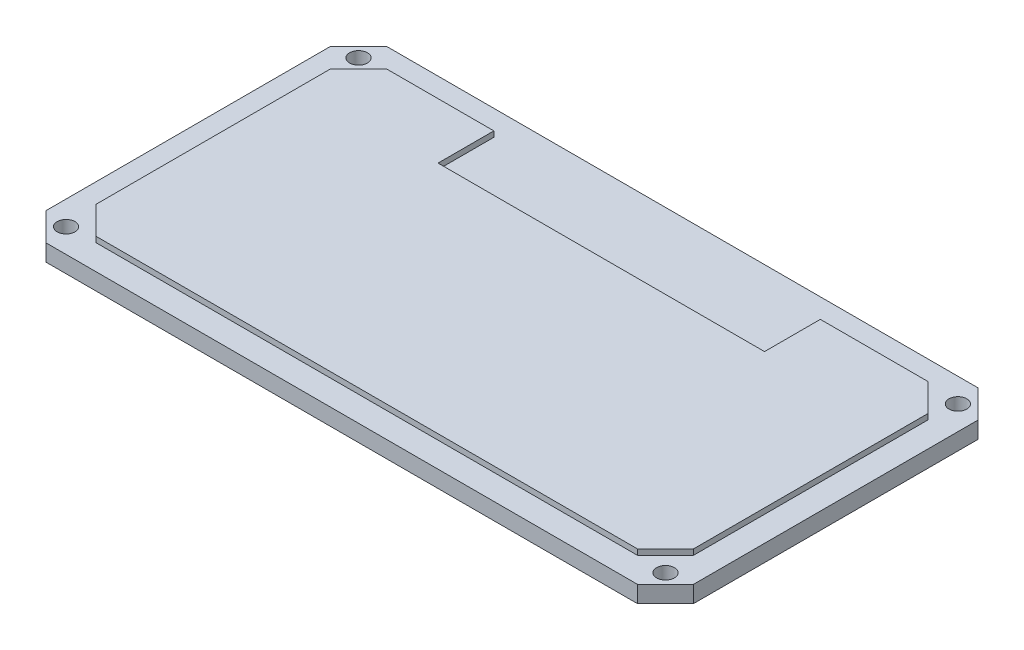
ISO-10303-21;
HEADER;
FILE_DESCRIPTION(('STEP AP214'),'2;1');
FILE_NAME('part.step','',(''),(''),'','','');
FILE_SCHEMA(('AUTOMOTIVE_DESIGN { 1 0 10303 214 1 1 1 1 }'));
ENDSEC;
DATA;
#1=APPLICATION_CONTEXT('core data for automotive mechanical design processes');
#2=APPLICATION_PROTOCOL_DEFINITION('international standard','automotive_design',2000,#1);
#3=PRODUCT_CONTEXT('',#1,'mechanical');
#4=PRODUCT('Part','Part','',(#3));
#5=PRODUCT_RELATED_PRODUCT_CATEGORY('part','',(#4));
#6=PRODUCT_DEFINITION_FORMATION('','',#4);
#7=PRODUCT_DEFINITION_CONTEXT('part definition',#1,'design');
#8=PRODUCT_DEFINITION('design','',#6,#7);
#9=PRODUCT_DEFINITION_SHAPE('','',#8);
#10=(LENGTH_UNIT() NAMED_UNIT(*) SI_UNIT(.MILLI.,.METRE.));
#11=(NAMED_UNIT(*) PLANE_ANGLE_UNIT() SI_UNIT($,.RADIAN.));
#12=(NAMED_UNIT(*) SI_UNIT($,.STERADIAN.) SOLID_ANGLE_UNIT());
#13=UNCERTAINTY_MEASURE_WITH_UNIT(LENGTH_MEASURE(1.E-05),#10,'distance_accuracy_value','');
#14=(GEOMETRIC_REPRESENTATION_CONTEXT(3) GLOBAL_UNCERTAINTY_ASSIGNED_CONTEXT((#13)) GLOBAL_UNIT_ASSIGNED_CONTEXT((#10,
#11,#12)) REPRESENTATION_CONTEXT('',''));
#15=CARTESIAN_POINT('',(0.,0.,0.));
#16=DIRECTION('',(0.,0.,1.));
#17=DIRECTION('',(1.,0.,0.));
#18=AXIS2_PLACEMENT_3D('',#15,#16,#17);
#19=CARTESIAN_POINT('',(-53.5,4.,-26.));
#20=DIRECTION('',(0.,0.,1.));
#21=DIRECTION('',(1.,0.,0.));
#22=AXIS2_PLACEMENT_3D('',#19,#20,#21);
#23=PLANE('',#22);
#24=DIRECTION('',(-1.,0.,0.));
#25=VECTOR('',#24,1.);
#26=CARTESIAN_POINT('',(-53.5,3.,-26.));
#27=LINE('',#26,#25);
#28=CARTESIAN_POINT('',(48.5,3.,-26.));
#29=VERTEX_POINT('',#28);
#30=CARTESIAN_POINT('',(29.25,3.,-26.));
#31=VERTEX_POINT('',#30);
#32=EDGE_CURVE('E161',#29,#31,#27,.T.);
#33=ORIENTED_EDGE('',*,*,#32,.T.);
#34=DIRECTION('',(0.,1.,0.));
#35=VECTOR('',#34,1.);
#36=CARTESIAN_POINT('',(29.25,3.,-26.));
#37=LINE('',#36,#35);
#38=CARTESIAN_POINT('',(29.25,4.,-26.));
#39=VERTEX_POINT('',#38);
#40=EDGE_CURVE('E472',#31,#39,#37,.T.);
#41=ORIENTED_EDGE('',*,*,#40,.T.);
#42=DIRECTION('',(-1.,0.,0.));
#43=VECTOR('',#42,1.);
#44=CARTESIAN_POINT('',(-53.5,4.,-26.));
#45=LINE('',#44,#43);
#46=CARTESIAN_POINT('',(48.5,4.,-26.));
#47=VERTEX_POINT('',#46);
#48=EDGE_CURVE('E131',#47,#39,#45,.T.);
#49=ORIENTED_EDGE('',*,*,#48,.F.);
#50=DIRECTION('',(0.,-1.,0.));
#51=VECTOR('',#50,1.);
#52=CARTESIAN_POINT('',(48.5,4.,-26.));
#53=LINE('',#52,#51);
#54=EDGE_CURVE('E147',#47,#29,#53,.T.);
#55=ORIENTED_EDGE('',*,*,#54,.T.);
#56=EDGE_LOOP('',(#33,#41,#49,#55));
#57=FACE_BOUND('',#56,.T.);
#58=ADVANCED_FACE('F33',(#57),#23,.F.);
#59=CARTESIAN_POINT('',(58.,3.,-30.5));
#60=DIRECTION('',(-1.,0.,0.));
#61=DIRECTION('',(0.,0.,1.));
#62=AXIS2_PLACEMENT_3D('',#59,#60,#61);
#63=PLANE('',#62);
#64=DIRECTION('',(0.,0.,-1.));
#65=VECTOR('',#64,1.);
#66=CARTESIAN_POINT('',(58.,0.,-30.5));
#67=LINE('',#66,#65);
#68=CARTESIAN_POINT('',(58.,0.,25.5));
#69=VERTEX_POINT('',#68);
#70=CARTESIAN_POINT('',(58.,0.,-25.5));
#71=VERTEX_POINT('',#70);
#72=EDGE_CURVE('E218',#69,#71,#67,.T.);
#73=ORIENTED_EDGE('',*,*,#72,.T.);
#74=DIRECTION('',(0.,1.,0.));
#75=VECTOR('',#74,1.);
#76=CARTESIAN_POINT('',(58.,3.,-25.5));
#77=LINE('',#76,#75);
#78=CARTESIAN_POINT('',(58.,3.,-25.5));
#79=VERTEX_POINT('',#78);
#80=EDGE_CURVE('E267',#71,#79,#77,.T.);
#81=ORIENTED_EDGE('',*,*,#80,.T.);
#82=DIRECTION('',(0.,0.,-1.));
#83=VECTOR('',#82,1.);
#84=CARTESIAN_POINT('',(58.,3.,-30.5));
#85=LINE('',#84,#83);
#86=CARTESIAN_POINT('',(58.,3.,25.5));
#87=VERTEX_POINT('',#86);
#88=EDGE_CURVE('E204',#87,#79,#85,.T.);
#89=ORIENTED_EDGE('',*,*,#88,.F.);
#90=DIRECTION('',(0.,-1.,0.));
#91=VECTOR('',#90,1.);
#92=CARTESIAN_POINT('',(58.,3.,25.5));
#93=LINE('',#92,#91);
#94=EDGE_CURVE('E264',#87,#69,#93,.T.);
#95=ORIENTED_EDGE('',*,*,#94,.T.);
#96=EDGE_LOOP('',(#73,#81,#89,#95));
#97=FACE_BOUND('',#96,.T.);
#98=ADVANCED_FACE('F305',(#97),#63,.F.);
#99=CARTESIAN_POINT('',(-58.,3.,-30.5));
#100=DIRECTION('',(0.,0.,1.));
#101=DIRECTION('',(1.,0.,0.));
#102=AXIS2_PLACEMENT_3D('',#99,#100,#101);
#103=PLANE('',#102);
#104=DIRECTION('',(-1.,0.,0.));
#105=VECTOR('',#104,1.);
#106=CARTESIAN_POINT('',(-58.,0.,-30.5));
#107=LINE('',#106,#105);
#108=CARTESIAN_POINT('',(53.,0.,-30.5));
#109=VERTEX_POINT('',#108);
#110=CARTESIAN_POINT('',(-53.,0.,-30.5));
#111=VERTEX_POINT('',#110);
#112=EDGE_CURVE('E221',#109,#111,#107,.T.);
#113=ORIENTED_EDGE('',*,*,#112,.T.);
#114=DIRECTION('',(0.,1.,0.));
#115=VECTOR('',#114,1.);
#116=CARTESIAN_POINT('',(-53.,3.,-30.5));
#117=LINE('',#116,#115);
#118=CARTESIAN_POINT('',(-53.,3.,-30.5));
#119=VERTEX_POINT('',#118);
#120=EDGE_CURVE('E249',#111,#119,#117,.T.);
#121=ORIENTED_EDGE('',*,*,#120,.T.);
#122=DIRECTION('',(-1.,0.,0.));
#123=VECTOR('',#122,1.);
#124=CARTESIAN_POINT('',(-58.,3.,-30.5));
#125=LINE('',#124,#123);
#126=CARTESIAN_POINT('',(53.,3.,-30.5));
#127=VERTEX_POINT('',#126);
#128=EDGE_CURVE('E207',#127,#119,#125,.T.);
#129=ORIENTED_EDGE('',*,*,#128,.F.);
#130=DIRECTION('',(0.,-1.,0.));
#131=VECTOR('',#130,1.);
#132=CARTESIAN_POINT('',(53.,3.,-30.5));
#133=LINE('',#132,#131);
#134=EDGE_CURVE('E246',#127,#109,#133,.T.);
#135=ORIENTED_EDGE('',*,*,#134,.T.);
#136=EDGE_LOOP('',(#113,#121,#129,#135));
#137=FACE_BOUND('',#136,.T.);
#138=ADVANCED_FACE('F312',(#137),#103,.F.);
#139=CARTESIAN_POINT('',(-58.,3.,-30.5));
#140=DIRECTION('',(1.,0.,0.));
#141=DIRECTION('',(0.,0.,-1.));
#142=AXIS2_PLACEMENT_3D('',#139,#140,#141);
#143=PLANE('',#142);
#144=DIRECTION('',(0.,0.,1.));
#145=VECTOR('',#144,1.);
#146=CARTESIAN_POINT('',(-58.,3.,-30.5));
#147=LINE('',#146,#145);
#148=CARTESIAN_POINT('',(-58.,3.,-25.5));
#149=VERTEX_POINT('',#148);
#150=CARTESIAN_POINT('',(-58.,3.,25.5));
#151=VERTEX_POINT('',#150);
#152=EDGE_CURVE('E211',#149,#151,#147,.T.);
#153=ORIENTED_EDGE('',*,*,#152,.F.);
#154=DIRECTION('',(0.,-1.,0.));
#155=VECTOR('',#154,1.);
#156=CARTESIAN_POINT('',(-58.,3.,-25.5));
#157=LINE('',#156,#155);
#158=CARTESIAN_POINT('',(-58.,0.,-25.5));
#159=VERTEX_POINT('',#158);
#160=EDGE_CURVE('E231',#149,#159,#157,.T.);
#161=ORIENTED_EDGE('',*,*,#160,.T.);
#162=DIRECTION('',(0.,0.,1.));
#163=VECTOR('',#162,1.);
#164=CARTESIAN_POINT('',(-58.,0.,-30.5));
#165=LINE('',#164,#163);
#166=CARTESIAN_POINT('',(-58.,0.,25.5));
#167=VERTEX_POINT('',#166);
#168=EDGE_CURVE('E224',#159,#167,#165,.T.);
#169=ORIENTED_EDGE('',*,*,#168,.T.);
#170=DIRECTION('',(0.,1.,0.));
#171=VECTOR('',#170,1.);
#172=CARTESIAN_POINT('',(-58.,3.,25.5));
#173=LINE('',#172,#171);
#174=EDGE_CURVE('E217',#167,#151,#173,.T.);
#175=ORIENTED_EDGE('',*,*,#174,.T.);
#176=EDGE_LOOP('',(#153,#161,#169,#175));
#177=FACE_BOUND('',#176,.T.);
#178=ADVANCED_FACE('F372',(#177),#143,.F.);
#179=CARTESIAN_POINT('',(-58.,3.,30.5));
#180=DIRECTION('',(0.,0.,-1.));
#181=DIRECTION('',(-1.,0.,0.));
#182=AXIS2_PLACEMENT_3D('',#179,#180,#181);
#183=PLANE('',#182);
#184=DIRECTION('',(1.,0.,0.));
#185=VECTOR('',#184,1.);
#186=CARTESIAN_POINT('',(-58.,0.,30.5));
#187=LINE('',#186,#185);
#188=CARTESIAN_POINT('',(-53.,0.,30.5));
#189=VERTEX_POINT('',#188);
#190=CARTESIAN_POINT('',(53.,0.,30.5));
#191=VERTEX_POINT('',#190);
#192=EDGE_CURVE('E208',#189,#191,#187,.T.);
#193=ORIENTED_EDGE('',*,*,#192,.T.);
#194=DIRECTION('',(0.,1.,0.));
#195=VECTOR('',#194,1.);
#196=CARTESIAN_POINT('',(53.,3.,30.5));
#197=LINE('',#196,#195);
#198=CARTESIAN_POINT('',(53.,3.,30.5));
#199=VERTEX_POINT('',#198);
#200=EDGE_CURVE('E273',#191,#199,#197,.T.);
#201=ORIENTED_EDGE('',*,*,#200,.T.);
#202=DIRECTION('',(1.,0.,0.));
#203=VECTOR('',#202,1.);
#204=CARTESIAN_POINT('',(-58.,3.,30.5));
#205=LINE('',#204,#203);
#206=CARTESIAN_POINT('',(-53.,3.,30.5));
#207=VERTEX_POINT('',#206);
#208=EDGE_CURVE('E214',#207,#199,#205,.T.);
#209=ORIENTED_EDGE('',*,*,#208,.F.);
#210=DIRECTION('',(0.,-1.,0.));
#211=VECTOR('',#210,1.);
#212=CARTESIAN_POINT('',(-53.,3.,30.5));
#213=LINE('',#212,#211);
#214=EDGE_CURVE('E270',#207,#189,#213,.T.);
#215=ORIENTED_EDGE('',*,*,#214,.T.);
#216=EDGE_LOOP('',(#193,#201,#209,#215));
#217=FACE_BOUND('',#216,.T.);
#218=ADVANCED_FACE('F376',(#217),#183,.F.);
#219=CARTESIAN_POINT('',(0.,3.,0.));
#220=DIRECTION('',(0.,1.,0.));
#221=DIRECTION('',(0.,0.,1.));
#222=AXIS2_PLACEMENT_3D('',#219,#220,#221);
#223=PLANE('',#222);
#224=CARTESIAN_POINT('',(-53.7,3.,-26.2));
#225=DIRECTION('',(0.,1.,0.));
#226=DIRECTION('',(0.,0.,1.));
#227=AXIS2_PLACEMENT_3D('',#224,#225,#226);
#228=CIRCLE('',#227,1.6);
#229=CARTESIAN_POINT('',(-53.7,3.,-24.6));
#230=VERTEX_POINT('',#229);
#231=EDGE_CURVE('E200',#230,#230,#228,.T.);
#232=ORIENTED_EDGE('',*,*,#231,.F.);
#233=EDGE_LOOP('',(#232));
#234=FACE_BOUND('',#233,.T.);
#235=CARTESIAN_POINT('',(-53.7,3.,26.2));
#236=DIRECTION('',(0.,1.,0.));
#237=DIRECTION('',(0.,0.,1.));
#238=AXIS2_PLACEMENT_3D('',#235,#236,#237);
#239=CIRCLE('',#238,1.6);
#240=CARTESIAN_POINT('',(-53.7,3.,27.8));
#241=VERTEX_POINT('',#240);
#242=EDGE_CURVE('E184',#241,#241,#239,.T.);
#243=ORIENTED_EDGE('',*,*,#242,.F.);
#244=EDGE_LOOP('',(#243));
#245=FACE_BOUND('',#244,.T.);
#246=CARTESIAN_POINT('',(53.7,3.,-26.2));
#247=DIRECTION('',(0.,1.,0.));
#248=DIRECTION('',(0.,0.,1.));
#249=AXIS2_PLACEMENT_3D('',#246,#247,#248);
#250=CIRCLE('',#249,1.6);
#251=CARTESIAN_POINT('',(53.7,3.,-24.6));
#252=VERTEX_POINT('',#251);
#253=EDGE_CURVE('E191',#252,#252,#250,.T.);
#254=ORIENTED_EDGE('',*,*,#253,.F.);
#255=EDGE_LOOP('',(#254));
#256=FACE_BOUND('',#255,.T.);
#257=CARTESIAN_POINT('',(53.7,3.,26.2));
#258=DIRECTION('',(0.,1.,0.));
#259=DIRECTION('',(0.,0.,1.));
#260=AXIS2_PLACEMENT_3D('',#257,#258,#259);
#261=CIRCLE('',#260,1.6);
#262=CARTESIAN_POINT('',(53.7,3.,27.8));
#263=VERTEX_POINT('',#262);
#264=EDGE_CURVE('E195',#263,#263,#261,.T.);
#265=ORIENTED_EDGE('',*,*,#264,.F.);
#266=EDGE_LOOP('',(#265));
#267=FACE_BOUND('',#266,.T.);
#268=DIRECTION('',(0.,0.,-1.));
#269=VECTOR('',#268,1.);
#270=CARTESIAN_POINT('',(53.5,3.,-26.));
#271=LINE('',#270,#269);
#272=CARTESIAN_POINT('',(53.5,3.,21.));
#273=VERTEX_POINT('',#272);
#274=CARTESIAN_POINT('',(53.5,3.,-21.));
#275=VERTEX_POINT('',#274);
#276=EDGE_CURVE('E158',#273,#275,#271,.T.);
#277=ORIENTED_EDGE('',*,*,#276,.F.);
#278=DIRECTION('',(0.707106781186548,0.,-0.707106781186547));
#279=VECTOR('',#278,1.);
#280=CARTESIAN_POINT('',(53.5,3.,21.));
#281=LINE('',#280,#279);
#282=CARTESIAN_POINT('',(48.5,3.,26.));
#283=VERTEX_POINT('',#282);
#284=EDGE_CURVE('E119',#273,#283,#281,.F.);
#285=ORIENTED_EDGE('',*,*,#284,.T.);
#286=DIRECTION('',(1.,0.,0.));
#287=VECTOR('',#286,1.);
#288=CARTESIAN_POINT('',(-53.5,3.,26.));
#289=LINE('',#288,#287);
#290=CARTESIAN_POINT('',(-48.5,3.,26.));
#291=VERTEX_POINT('',#290);
#292=EDGE_CURVE('E168',#291,#283,#289,.T.);
#293=ORIENTED_EDGE('',*,*,#292,.F.);
#294=DIRECTION('',(0.707106781186546,0.,0.707106781186549));
#295=VECTOR('',#294,1.);
#296=CARTESIAN_POINT('',(-48.5,3.,26.));
#297=LINE('',#296,#295);
#298=CARTESIAN_POINT('',(-53.5,3.,21.));
#299=VERTEX_POINT('',#298);
#300=EDGE_CURVE('E41',#291,#299,#297,.F.);
#301=ORIENTED_EDGE('',*,*,#300,.T.);
#302=DIRECTION('',(0.,0.,1.));
#303=VECTOR('',#302,1.);
#304=CARTESIAN_POINT('',(-53.5,3.,-26.));
#305=LINE('',#304,#303);
#306=CARTESIAN_POINT('',(-53.5,3.,-21.));
#307=VERTEX_POINT('',#306);
#308=EDGE_CURVE('E117',#307,#299,#305,.T.);
#309=ORIENTED_EDGE('',*,*,#308,.F.);
#310=DIRECTION('',(-0.707106781186549,0.,0.707106781186547));
#311=VECTOR('',#310,1.);
#312=CARTESIAN_POINT('',(-53.5,3.,-21.));
#313=LINE('',#312,#311);
#314=CARTESIAN_POINT('',(-48.5,3.,-26.));
#315=VERTEX_POINT('',#314);
#316=EDGE_CURVE('E11',#307,#315,#313,.F.);
#317=ORIENTED_EDGE('',*,*,#316,.T.);
#318=CARTESIAN_POINT('',(-29.25,3.,-26.));
#319=VERTEX_POINT('',#318);
#320=EDGE_CURVE('E276',#319,#315,#27,.T.);
#321=ORIENTED_EDGE('',*,*,#320,.F.);
#322=DIRECTION('',(0.,0.,1.));
#323=VECTOR('',#322,1.);
#324=CARTESIAN_POINT('',(-29.25,3.,-26.));
#325=LINE('',#324,#323);
#326=CARTESIAN_POINT('',(-29.25,3.,-16.));
#327=VERTEX_POINT('',#326);
#328=EDGE_CURVE('E479',#319,#327,#325,.T.);
#329=ORIENTED_EDGE('',*,*,#328,.T.);
#330=DIRECTION('',(1.,0.,0.));
#331=VECTOR('',#330,1.);
#332=CARTESIAN_POINT('',(29.25,3.,-16.));
#333=LINE('',#332,#331);
#334=CARTESIAN_POINT('',(29.25,3.,-16.));
#335=VERTEX_POINT('',#334);
#336=EDGE_CURVE('E477',#327,#335,#333,.T.);
#337=ORIENTED_EDGE('',*,*,#336,.T.);
#338=DIRECTION('',(0.,0.,-1.));
#339=VECTOR('',#338,1.);
#340=CARTESIAN_POINT('',(29.25,3.,-26.));
#341=LINE('',#340,#339);
#342=EDGE_CURVE('E473',#335,#31,#341,.T.);
#343=ORIENTED_EDGE('',*,*,#342,.T.);
#344=ORIENTED_EDGE('',*,*,#32,.F.);
#345=DIRECTION('',(-0.707106781186545,0.,-0.70710678118655));
#346=VECTOR('',#345,1.);
#347=CARTESIAN_POINT('',(48.5,3.,-26.));
#348=LINE('',#347,#346);
#349=EDGE_CURVE('E152',#29,#275,#348,.F.);
#350=ORIENTED_EDGE('',*,*,#349,.T.);
#351=EDGE_LOOP('',(#277,#285,#293,#301,#309,#317,#321,#329,#337,#343,#344,#350));
#352=FACE_BOUND('',#351,.T.);
#353=ORIENTED_EDGE('',*,*,#128,.T.);
#354=DIRECTION('',(0.70710678118655,0.,-0.707106781186546));
#355=VECTOR('',#354,1.);
#356=CARTESIAN_POINT('',(-41.7499999999998,3.,-41.7500000000001));
#357=LINE('',#356,#355);
#358=EDGE_CURVE('E261',#119,#149,#357,.F.);
#359=ORIENTED_EDGE('',*,*,#358,.T.);
#360=ORIENTED_EDGE('',*,*,#152,.T.);
#361=DIRECTION('',(-0.707106781186548,0.,-0.707106781186548));
#362=VECTOR('',#361,1.);
#363=CARTESIAN_POINT('',(-41.75,3.,41.75));
#364=LINE('',#363,#362);
#365=EDGE_CURVE('E252',#151,#207,#364,.F.);
#366=ORIENTED_EDGE('',*,*,#365,.T.);
#367=ORIENTED_EDGE('',*,*,#208,.T.);
#368=DIRECTION('',(-0.707106781186549,0.,0.707106781186546));
#369=VECTOR('',#368,1.);
#370=CARTESIAN_POINT('',(41.7499999999999,3.,41.7500000000001));
#371=LINE('',#370,#369);
#372=EDGE_CURVE('E255',#199,#87,#371,.F.);
#373=ORIENTED_EDGE('',*,*,#372,.T.);
#374=ORIENTED_EDGE('',*,*,#88,.T.);
#375=DIRECTION('',(0.707106781186547,0.,0.707106781186548));
#376=VECTOR('',#375,1.);
#377=CARTESIAN_POINT('',(41.7500000000001,3.,-41.75));
#378=LINE('',#377,#376);
#379=EDGE_CURVE('E258',#79,#127,#378,.F.);
#380=ORIENTED_EDGE('',*,*,#379,.T.);
#381=EDGE_LOOP('',(#353,#359,#360,#366,#367,#373,#374,#380));
#382=FACE_BOUND('',#381,.T.);
#383=ADVANCED_FACE('F156',(#234,#245,#256,#267,#352,#382),#223,.T.);
#384=CARTESIAN_POINT('',(0.,0.,0.));
#385=DIRECTION('',(0.,1.,0.));
#386=DIRECTION('',(0.,0.,1.));
#387=AXIS2_PLACEMENT_3D('',#384,#385,#386);
#388=PLANE('',#387);
#389=CARTESIAN_POINT('',(53.7,0.,-26.2));
#390=DIRECTION('',(0.,1.,0.));
#391=DIRECTION('',(0.,0.,1.));
#392=AXIS2_PLACEMENT_3D('',#389,#390,#391);
#393=CIRCLE('',#392,1.6);
#394=CARTESIAN_POINT('',(53.7,0.,-24.6));
#395=VERTEX_POINT('',#394);
#396=EDGE_CURVE('E175',#395,#395,#393,.T.);
#397=ORIENTED_EDGE('',*,*,#396,.T.);
#398=EDGE_LOOP('',(#397));
#399=FACE_BOUND('',#398,.T.);
#400=CARTESIAN_POINT('',(53.7,0.,26.2));
#401=DIRECTION('',(0.,1.,0.));
#402=DIRECTION('',(0.,0.,1.));
#403=AXIS2_PLACEMENT_3D('',#400,#401,#402);
#404=CIRCLE('',#403,1.6);
#405=CARTESIAN_POINT('',(53.7,0.,27.8));
#406=VERTEX_POINT('',#405);
#407=EDGE_CURVE('E280',#406,#406,#404,.T.);
#408=ORIENTED_EDGE('',*,*,#407,.T.);
#409=EDGE_LOOP('',(#408));
#410=FACE_BOUND('',#409,.T.);
#411=CARTESIAN_POINT('',(-53.7,0.,26.2));
#412=DIRECTION('',(0.,1.,0.));
#413=DIRECTION('',(0.,0.,1.));
#414=AXIS2_PLACEMENT_3D('',#411,#412,#413);
#415=CIRCLE('',#414,1.6);
#416=CARTESIAN_POINT('',(-53.7,0.,27.8));
#417=VERTEX_POINT('',#416);
#418=EDGE_CURVE('E194',#417,#417,#415,.T.);
#419=ORIENTED_EDGE('',*,*,#418,.T.);
#420=EDGE_LOOP('',(#419));
#421=FACE_BOUND('',#420,.T.);
#422=CARTESIAN_POINT('',(-53.7,0.,-26.2));
#423=DIRECTION('',(0.,1.,0.));
#424=DIRECTION('',(0.,0.,1.));
#425=AXIS2_PLACEMENT_3D('',#422,#423,#424);
#426=CIRCLE('',#425,1.6);
#427=CARTESIAN_POINT('',(-53.7,0.,-24.6));
#428=VERTEX_POINT('',#427);
#429=EDGE_CURVE('E203',#428,#428,#426,.T.);
#430=ORIENTED_EDGE('',*,*,#429,.T.);
#431=EDGE_LOOP('',(#430));
#432=FACE_BOUND('',#431,.T.);
#433=ORIENTED_EDGE('',*,*,#168,.F.);
#434=DIRECTION('',(-0.70710678118655,0.,0.707106781186546));
#435=VECTOR('',#434,1.);
#436=CARTESIAN_POINT('',(-58.,0.,-25.5));
#437=LINE('',#436,#435);
#438=EDGE_CURVE('E243',#159,#111,#437,.F.);
#439=ORIENTED_EDGE('',*,*,#438,.T.);
#440=ORIENTED_EDGE('',*,*,#112,.F.);
#441=DIRECTION('',(-0.707106781186547,0.,-0.707106781186548));
#442=VECTOR('',#441,1.);
#443=CARTESIAN_POINT('',(53.,0.,-30.5));
#444=LINE('',#443,#442);
#445=EDGE_CURVE('E240',#109,#71,#444,.F.);
#446=ORIENTED_EDGE('',*,*,#445,.T.);
#447=ORIENTED_EDGE('',*,*,#72,.F.);
#448=DIRECTION('',(0.707106781186549,0.,-0.707106781186546));
#449=VECTOR('',#448,1.);
#450=CARTESIAN_POINT('',(58.,0.,25.5));
#451=LINE('',#450,#449);
#452=EDGE_CURVE('E237',#69,#191,#451,.F.);
#453=ORIENTED_EDGE('',*,*,#452,.T.);
#454=ORIENTED_EDGE('',*,*,#192,.F.);
#455=DIRECTION('',(0.707106781186548,0.,0.707106781186548));
#456=VECTOR('',#455,1.);
#457=CARTESIAN_POINT('',(-53.,0.,30.5));
#458=LINE('',#457,#456);
#459=EDGE_CURVE('E234',#189,#167,#458,.F.);
#460=ORIENTED_EDGE('',*,*,#459,.T.);
#461=EDGE_LOOP('',(#433,#439,#440,#446,#447,#453,#454,#460));
#462=FACE_BOUND('',#461,.T.);
#463=ADVANCED_FACE('F287',(#399,#410,#421,#432,#462),#388,.F.);
#464=CARTESIAN_POINT('',(-58.,3.,-25.5));
#465=DIRECTION('',(0.707106781186545,0.,0.707106781186549));
#466=DIRECTION('',(0.,-1.,0.));
#467=AXIS2_PLACEMENT_3D('',#464,#465,#466);
#468=PLANE('',#467);
#469=ORIENTED_EDGE('',*,*,#358,.F.);
#470=ORIENTED_EDGE('',*,*,#120,.F.);
#471=ORIENTED_EDGE('',*,*,#438,.F.);
#472=ORIENTED_EDGE('',*,*,#160,.F.);
#473=EDGE_LOOP('',(#469,#470,#471,#472));
#474=FACE_BOUND('',#473,.T.);
#475=ADVANCED_FACE('F365',(#474),#468,.F.);
#476=CARTESIAN_POINT('',(53.,3.,-30.5));
#477=DIRECTION('',(-0.707106781186548,0.,0.707106781186547));
#478=DIRECTION('',(0.,-1.,0.));
#479=AXIS2_PLACEMENT_3D('',#476,#477,#478);
#480=PLANE('',#479);
#481=ORIENTED_EDGE('',*,*,#379,.F.);
#482=ORIENTED_EDGE('',*,*,#80,.F.);
#483=ORIENTED_EDGE('',*,*,#445,.F.);
#484=ORIENTED_EDGE('',*,*,#134,.F.);
#485=EDGE_LOOP('',(#481,#482,#483,#484));
#486=FACE_BOUND('',#485,.T.);
#487=ADVANCED_FACE('F361',(#486),#480,.F.);
#488=CARTESIAN_POINT('',(58.,3.,25.5));
#489=DIRECTION('',(-0.707106781186546,0.,-0.707106781186549));
#490=DIRECTION('',(0.,-1.,0.));
#491=AXIS2_PLACEMENT_3D('',#488,#489,#490);
#492=PLANE('',#491);
#493=ORIENTED_EDGE('',*,*,#372,.F.);
#494=ORIENTED_EDGE('',*,*,#200,.F.);
#495=ORIENTED_EDGE('',*,*,#452,.F.);
#496=ORIENTED_EDGE('',*,*,#94,.F.);
#497=EDGE_LOOP('',(#493,#494,#495,#496));
#498=FACE_BOUND('',#497,.T.);
#499=ADVANCED_FACE('F357',(#498),#492,.F.);
#500=CARTESIAN_POINT('',(-53.,3.,30.5));
#501=DIRECTION('',(0.707106781186547,0.,-0.707106781186547));
#502=DIRECTION('',(0.,-1.,0.));
#503=AXIS2_PLACEMENT_3D('',#500,#501,#502);
#504=PLANE('',#503);
#505=ORIENTED_EDGE('',*,*,#365,.F.);
#506=ORIENTED_EDGE('',*,*,#174,.F.);
#507=ORIENTED_EDGE('',*,*,#459,.F.);
#508=ORIENTED_EDGE('',*,*,#214,.F.);
#509=EDGE_LOOP('',(#505,#506,#507,#508));
#510=FACE_BOUND('',#509,.T.);
#511=ADVANCED_FACE('F353',(#510),#504,.F.);
#512=CARTESIAN_POINT('',(-53.7,-7.,-26.2));
#513=DIRECTION('',(0.,1.,0.));
#514=DIRECTION('',(0.,0.,1.));
#515=AXIS2_PLACEMENT_3D('',#512,#513,#514);
#516=CYLINDRICAL_SURFACE('',#515,1.6);
#517=ORIENTED_EDGE('',*,*,#231,.T.);
#518=EDGE_LOOP('',(#517));
#519=FACE_BOUND('',#518,.T.);
#520=ORIENTED_EDGE('',*,*,#429,.F.);
#521=EDGE_LOOP('',(#520));
#522=FACE_BOUND('',#521,.T.);
#523=ADVANCED_FACE('F356',(#519,#522),#516,.F.);
#524=CARTESIAN_POINT('',(-53.7,-7.,26.2));
#525=DIRECTION('',(0.,1.,0.));
#526=DIRECTION('',(0.,0.,1.));
#527=AXIS2_PLACEMENT_3D('',#524,#525,#526);
#528=CYLINDRICAL_SURFACE('',#527,1.6);
#529=ORIENTED_EDGE('',*,*,#242,.T.);
#530=EDGE_LOOP('',(#529));
#531=FACE_BOUND('',#530,.T.);
#532=ORIENTED_EDGE('',*,*,#418,.F.);
#533=EDGE_LOOP('',(#532));
#534=FACE_BOUND('',#533,.T.);
#535=ADVANCED_FACE('F301',(#531,#534),#528,.F.);
#536=CARTESIAN_POINT('',(53.7,-7.,26.2));
#537=DIRECTION('',(0.,1.,0.));
#538=DIRECTION('',(0.,0.,1.));
#539=AXIS2_PLACEMENT_3D('',#536,#537,#538);
#540=CYLINDRICAL_SURFACE('',#539,1.6);
#541=ORIENTED_EDGE('',*,*,#264,.T.);
#542=EDGE_LOOP('',(#541));
#543=FACE_BOUND('',#542,.T.);
#544=ORIENTED_EDGE('',*,*,#407,.F.);
#545=EDGE_LOOP('',(#544));
#546=FACE_BOUND('',#545,.T.);
#547=ADVANCED_FACE('F291',(#543,#546),#540,.F.);
#548=CARTESIAN_POINT('',(53.7,-7.,-26.2));
#549=DIRECTION('',(0.,1.,0.));
#550=DIRECTION('',(0.,0.,1.));
#551=AXIS2_PLACEMENT_3D('',#548,#549,#550);
#552=CYLINDRICAL_SURFACE('',#551,1.6);
#553=ORIENTED_EDGE('',*,*,#253,.T.);
#554=EDGE_LOOP('',(#553));
#555=FACE_BOUND('',#554,.T.);
#556=ORIENTED_EDGE('',*,*,#396,.F.);
#557=EDGE_LOOP('',(#556));
#558=FACE_BOUND('',#557,.T.);
#559=ADVANCED_FACE('F289',(#555,#558),#552,.F.);
#560=CARTESIAN_POINT('',(53.5,4.,-26.));
#561=DIRECTION('',(-1.,0.,0.));
#562=DIRECTION('',(0.,0.,1.));
#563=AXIS2_PLACEMENT_3D('',#560,#561,#562);
#564=PLANE('',#563);
#565=DIRECTION('',(0.,0.,-1.));
#566=VECTOR('',#565,1.);
#567=CARTESIAN_POINT('',(53.5,4.,-26.));
#568=LINE('',#567,#566);
#569=CARTESIAN_POINT('',(53.5,4.,21.));
#570=VERTEX_POINT('',#569);
#571=CARTESIAN_POINT('',(53.5,4.,-21.));
#572=VERTEX_POINT('',#571);
#573=EDGE_CURVE('E327',#570,#572,#568,.T.);
#574=ORIENTED_EDGE('',*,*,#573,.F.);
#575=DIRECTION('',(0.,-1.,0.));
#576=VECTOR('',#575,1.);
#577=CARTESIAN_POINT('',(53.5,4.,21.));
#578=LINE('',#577,#576);
#579=EDGE_CURVE('E167',#570,#273,#578,.T.);
#580=ORIENTED_EDGE('',*,*,#579,.T.);
#581=ORIENTED_EDGE('',*,*,#276,.T.);
#582=DIRECTION('',(0.,1.,0.));
#583=VECTOR('',#582,1.);
#584=CARTESIAN_POINT('',(53.5,4.,-21.));
#585=LINE('',#584,#583);
#586=EDGE_CURVE('E89',#275,#572,#585,.T.);
#587=ORIENTED_EDGE('',*,*,#586,.T.);
#588=EDGE_LOOP('',(#574,#580,#581,#587));
#589=FACE_BOUND('',#588,.T.);
#590=ADVANCED_FACE('F165',(#589),#564,.F.);
#591=CARTESIAN_POINT('',(-29.25,4.,-26.));
#592=VERTEX_POINT('',#591);
#593=CARTESIAN_POINT('',(-48.5,4.,-26.));
#594=VERTEX_POINT('',#593);
#595=EDGE_CURVE('E322',#592,#594,#45,.T.);
#596=ORIENTED_EDGE('',*,*,#595,.F.);
#597=DIRECTION('',(0.,1.,0.));
#598=VECTOR('',#597,1.);
#599=CARTESIAN_POINT('',(-29.25,3.,-26.));
#600=LINE('',#599,#598);
#601=EDGE_CURVE('E48',#319,#592,#600,.T.);
#602=ORIENTED_EDGE('',*,*,#601,.F.);
#603=ORIENTED_EDGE('',*,*,#320,.T.);
#604=DIRECTION('',(0.,1.,0.));
#605=VECTOR('',#604,1.);
#606=CARTESIAN_POINT('',(-48.5,4.,-26.));
#607=LINE('',#606,#605);
#608=EDGE_CURVE('E144',#315,#594,#607,.T.);
#609=ORIENTED_EDGE('',*,*,#608,.T.);
#610=EDGE_LOOP('',(#596,#602,#603,#609));
#611=FACE_BOUND('',#610,.T.);
#612=ADVANCED_FACE('F299',(#611),#23,.F.);
#613=CARTESIAN_POINT('',(-53.5,4.,-26.));
#614=DIRECTION('',(1.,0.,0.));
#615=DIRECTION('',(0.,0.,-1.));
#616=AXIS2_PLACEMENT_3D('',#613,#614,#615);
#617=PLANE('',#616);
#618=ORIENTED_EDGE('',*,*,#308,.T.);
#619=DIRECTION('',(0.,1.,0.));
#620=VECTOR('',#619,1.);
#621=CARTESIAN_POINT('',(-53.5,4.,21.));
#622=LINE('',#621,#620);
#623=CARTESIAN_POINT('',(-53.5,4.,21.));
#624=VERTEX_POINT('',#623);
#625=EDGE_CURVE('E111',#299,#624,#622,.T.);
#626=ORIENTED_EDGE('',*,*,#625,.T.);
#627=DIRECTION('',(0.,0.,1.));
#628=VECTOR('',#627,1.);
#629=CARTESIAN_POINT('',(-53.5,4.,-26.));
#630=LINE('',#629,#628);
#631=CARTESIAN_POINT('',(-53.5,4.,-21.));
#632=VERTEX_POINT('',#631);
#633=EDGE_CURVE('E115',#632,#624,#630,.T.);
#634=ORIENTED_EDGE('',*,*,#633,.F.);
#635=DIRECTION('',(0.,-1.,0.));
#636=VECTOR('',#635,1.);
#637=CARTESIAN_POINT('',(-53.5,4.,-21.));
#638=LINE('',#637,#636);
#639=EDGE_CURVE('E120',#632,#307,#638,.T.);
#640=ORIENTED_EDGE('',*,*,#639,.T.);
#641=EDGE_LOOP('',(#618,#626,#634,#640));
#642=FACE_BOUND('',#641,.T.);
#643=ADVANCED_FACE('F113',(#642),#617,.F.);
#644=CARTESIAN_POINT('',(-53.5,4.,26.));
#645=DIRECTION('',(0.,0.,-1.));
#646=DIRECTION('',(-1.,0.,0.));
#647=AXIS2_PLACEMENT_3D('',#644,#645,#646);
#648=PLANE('',#647);
#649=ORIENTED_EDGE('',*,*,#292,.T.);
#650=DIRECTION('',(0.,1.,0.));
#651=VECTOR('',#650,1.);
#652=CARTESIAN_POINT('',(48.5,4.,26.));
#653=LINE('',#652,#651);
#654=CARTESIAN_POINT('',(48.5,4.,26.));
#655=VERTEX_POINT('',#654);
#656=EDGE_CURVE('E139',#283,#655,#653,.T.);
#657=ORIENTED_EDGE('',*,*,#656,.T.);
#658=DIRECTION('',(1.,0.,0.));
#659=VECTOR('',#658,1.);
#660=CARTESIAN_POINT('',(-53.5,4.,26.));
#661=LINE('',#660,#659);
#662=CARTESIAN_POINT('',(-48.5,4.,26.));
#663=VERTEX_POINT('',#662);
#664=EDGE_CURVE('E130',#663,#655,#661,.T.);
#665=ORIENTED_EDGE('',*,*,#664,.F.);
#666=DIRECTION('',(0.,-1.,0.));
#667=VECTOR('',#666,1.);
#668=CARTESIAN_POINT('',(-48.5,4.,26.));
#669=LINE('',#668,#667);
#670=EDGE_CURVE('E134',#663,#291,#669,.T.);
#671=ORIENTED_EDGE('',*,*,#670,.T.);
#672=EDGE_LOOP('',(#649,#657,#665,#671));
#673=FACE_BOUND('',#672,.T.);
#674=ADVANCED_FACE('F181',(#673),#648,.F.);
#675=CARTESIAN_POINT('',(0.,4.,0.));
#676=DIRECTION('',(0.,1.,0.));
#677=DIRECTION('',(0.,0.,1.));
#678=AXIS2_PLACEMENT_3D('',#675,#676,#677);
#679=PLANE('',#678);
#680=DIRECTION('',(0.,0.,-1.));
#681=VECTOR('',#680,1.);
#682=CARTESIAN_POINT('',(29.25,4.,-26.));
#683=LINE('',#682,#681);
#684=CARTESIAN_POINT('',(29.25,4.,-16.));
#685=VERTEX_POINT('',#684);
#686=EDGE_CURVE('E475',#685,#39,#683,.T.);
#687=ORIENTED_EDGE('',*,*,#686,.F.);
#688=DIRECTION('',(1.,0.,0.));
#689=VECTOR('',#688,1.);
#690=CARTESIAN_POINT('',(29.25,4.,-16.));
#691=LINE('',#690,#689);
#692=CARTESIAN_POINT('',(-29.25,4.,-16.));
#693=VERTEX_POINT('',#692);
#694=EDGE_CURVE('E480',#693,#685,#691,.T.);
#695=ORIENTED_EDGE('',*,*,#694,.F.);
#696=DIRECTION('',(0.,0.,1.));
#697=VECTOR('',#696,1.);
#698=CARTESIAN_POINT('',(-29.25,4.,-26.));
#699=LINE('',#698,#697);
#700=EDGE_CURVE('E484',#592,#693,#699,.T.);
#701=ORIENTED_EDGE('',*,*,#700,.F.);
#702=ORIENTED_EDGE('',*,*,#595,.T.);
#703=DIRECTION('',(0.707106781186549,0.,-0.707106781186547));
#704=VECTOR('',#703,1.);
#705=CARTESIAN_POINT('',(-37.2499999999999,4.,-37.25));
#706=LINE('',#705,#704);
#707=EDGE_CURVE('E129',#594,#632,#706,.F.);
#708=ORIENTED_EDGE('',*,*,#707,.T.);
#709=ORIENTED_EDGE('',*,*,#633,.T.);
#710=DIRECTION('',(-0.707106781186546,0.,-0.707106781186549));
#711=VECTOR('',#710,1.);
#712=CARTESIAN_POINT('',(-37.2500000000001,4.,37.2499999999999));
#713=LINE('',#712,#711);
#714=EDGE_CURVE('E126',#624,#663,#713,.F.);
#715=ORIENTED_EDGE('',*,*,#714,.T.);
#716=ORIENTED_EDGE('',*,*,#664,.T.);
#717=DIRECTION('',(-0.707106781186548,0.,0.707106781186547));
#718=VECTOR('',#717,1.);
#719=CARTESIAN_POINT('',(37.25,4.,37.25));
#720=LINE('',#719,#718);
#721=EDGE_CURVE('E137',#655,#570,#720,.F.);
#722=ORIENTED_EDGE('',*,*,#721,.T.);
#723=ORIENTED_EDGE('',*,*,#573,.T.);
#724=DIRECTION('',(0.707106781186545,0.,0.70710678118655));
#725=VECTOR('',#724,1.);
#726=CARTESIAN_POINT('',(37.2500000000002,4.,-37.2499999999999));
#727=LINE('',#726,#725);
#728=EDGE_CURVE('E135',#572,#47,#727,.F.);
#729=ORIENTED_EDGE('',*,*,#728,.T.);
#730=ORIENTED_EDGE('',*,*,#48,.T.);
#731=EDGE_LOOP('',(#687,#695,#701,#702,#708,#709,#715,#716,#722,#723,#729,#730));
#732=FACE_BOUND('',#731,.T.);
#733=ADVANCED_FACE('F124',(#732),#679,.T.);
#734=CARTESIAN_POINT('',(53.5,4.,21.));
#735=DIRECTION('',(-0.707106781186547,0.,-0.707106781186548));
#736=DIRECTION('',(0.,-1.,0.));
#737=AXIS2_PLACEMENT_3D('',#734,#735,#736);
#738=PLANE('',#737);
#739=ORIENTED_EDGE('',*,*,#721,.F.);
#740=ORIENTED_EDGE('',*,*,#656,.F.);
#741=ORIENTED_EDGE('',*,*,#284,.F.);
#742=ORIENTED_EDGE('',*,*,#579,.F.);
#743=EDGE_LOOP('',(#739,#740,#741,#742));
#744=FACE_BOUND('',#743,.T.);
#745=ADVANCED_FACE('F186',(#744),#738,.F.);
#746=CARTESIAN_POINT('',(48.5,4.,-26.));
#747=DIRECTION('',(-0.70710678118655,0.,0.707106781186545));
#748=DIRECTION('',(0.,-1.,0.));
#749=AXIS2_PLACEMENT_3D('',#746,#747,#748);
#750=PLANE('',#749);
#751=ORIENTED_EDGE('',*,*,#728,.F.);
#752=ORIENTED_EDGE('',*,*,#586,.F.);
#753=ORIENTED_EDGE('',*,*,#349,.F.);
#754=ORIENTED_EDGE('',*,*,#54,.F.);
#755=EDGE_LOOP('',(#751,#752,#753,#754));
#756=FACE_BOUND('',#755,.T.);
#757=ADVANCED_FACE('F171',(#756),#750,.F.);
#758=CARTESIAN_POINT('',(-48.5,4.,26.));
#759=DIRECTION('',(0.707106781186549,0.,-0.707106781186545));
#760=DIRECTION('',(0.,-1.,0.));
#761=AXIS2_PLACEMENT_3D('',#758,#759,#760);
#762=PLANE('',#761);
#763=ORIENTED_EDGE('',*,*,#714,.F.);
#764=ORIENTED_EDGE('',*,*,#625,.F.);
#765=ORIENTED_EDGE('',*,*,#300,.F.);
#766=ORIENTED_EDGE('',*,*,#670,.F.);
#767=EDGE_LOOP('',(#763,#764,#765,#766));
#768=FACE_BOUND('',#767,.T.);
#769=ADVANCED_FACE('F133',(#768),#762,.F.);
#770=CARTESIAN_POINT('',(-53.5,4.,-21.));
#771=DIRECTION('',(0.707106781186546,0.,0.707106781186548));
#772=DIRECTION('',(0.,-1.,0.));
#773=AXIS2_PLACEMENT_3D('',#770,#771,#772);
#774=PLANE('',#773);
#775=ORIENTED_EDGE('',*,*,#707,.F.);
#776=ORIENTED_EDGE('',*,*,#608,.F.);
#777=ORIENTED_EDGE('',*,*,#316,.F.);
#778=ORIENTED_EDGE('',*,*,#639,.F.);
#779=EDGE_LOOP('',(#775,#776,#777,#778));
#780=FACE_BOUND('',#779,.T.);
#781=ADVANCED_FACE('F35',(#780),#774,.F.);
#782=CARTESIAN_POINT('',(29.25,3.,-26.));
#783=DIRECTION('',(1.,0.,0.));
#784=DIRECTION('',(0.,0.,-1.));
#785=AXIS2_PLACEMENT_3D('',#782,#783,#784);
#786=PLANE('',#785);
#787=ORIENTED_EDGE('',*,*,#686,.T.);
#788=ORIENTED_EDGE('',*,*,#40,.F.);
#789=ORIENTED_EDGE('',*,*,#342,.F.);
#790=DIRECTION('',(0.,1.,0.));
#791=VECTOR('',#790,1.);
#792=CARTESIAN_POINT('',(29.25,3.,-16.));
#793=LINE('',#792,#791);
#794=EDGE_CURVE('E330',#335,#685,#793,.T.);
#795=ORIENTED_EDGE('',*,*,#794,.T.);
#796=EDGE_LOOP('',(#787,#788,#789,#795));
#797=FACE_BOUND('',#796,.T.);
#798=ADVANCED_FACE('F338',(#797),#786,.F.);
#799=CARTESIAN_POINT('',(29.25,3.,-16.));
#800=DIRECTION('',(0.,0.,1.));
#801=DIRECTION('',(1.,0.,0.));
#802=AXIS2_PLACEMENT_3D('',#799,#800,#801);
#803=PLANE('',#802);
#804=ORIENTED_EDGE('',*,*,#694,.T.);
#805=ORIENTED_EDGE('',*,*,#794,.F.);
#806=ORIENTED_EDGE('',*,*,#336,.F.);
#807=DIRECTION('',(0.,1.,0.));
#808=VECTOR('',#807,1.);
#809=CARTESIAN_POINT('',(-29.25,3.,-16.));
#810=LINE('',#809,#808);
#811=EDGE_CURVE('E491',#327,#693,#810,.T.);
#812=ORIENTED_EDGE('',*,*,#811,.T.);
#813=EDGE_LOOP('',(#804,#805,#806,#812));
#814=FACE_BOUND('',#813,.T.);
#815=ADVANCED_FACE('F343',(#814),#803,.F.);
#816=CARTESIAN_POINT('',(-29.25,3.,-26.));
#817=DIRECTION('',(-1.,0.,0.));
#818=DIRECTION('',(0.,0.,1.));
#819=AXIS2_PLACEMENT_3D('',#816,#817,#818);
#820=PLANE('',#819);
#821=ORIENTED_EDGE('',*,*,#700,.T.);
#822=ORIENTED_EDGE('',*,*,#811,.F.);
#823=ORIENTED_EDGE('',*,*,#328,.F.);
#824=ORIENTED_EDGE('',*,*,#601,.T.);
#825=EDGE_LOOP('',(#821,#822,#823,#824));
#826=FACE_BOUND('',#825,.T.);
#827=ADVANCED_FACE('F495',(#826),#820,.F.);
#828=CLOSED_SHELL('',(#58,#98,#138,#178,#218,#383,#463,#475,#487,#499,#511,#523,#535,#547,#559,
#590,#612,#643,#674,#733,#745,#757,#769,#781,#798,#815,#827));
#829=MANIFOLD_SOLID_BREP('B2',#828);
#830=ADVANCED_BREP_SHAPE_REPRESENTATION('',(#18,#829),#14);
#831=SHAPE_DEFINITION_REPRESENTATION(#9,#830);
ENDSEC;
END-ISO-10303-21;
